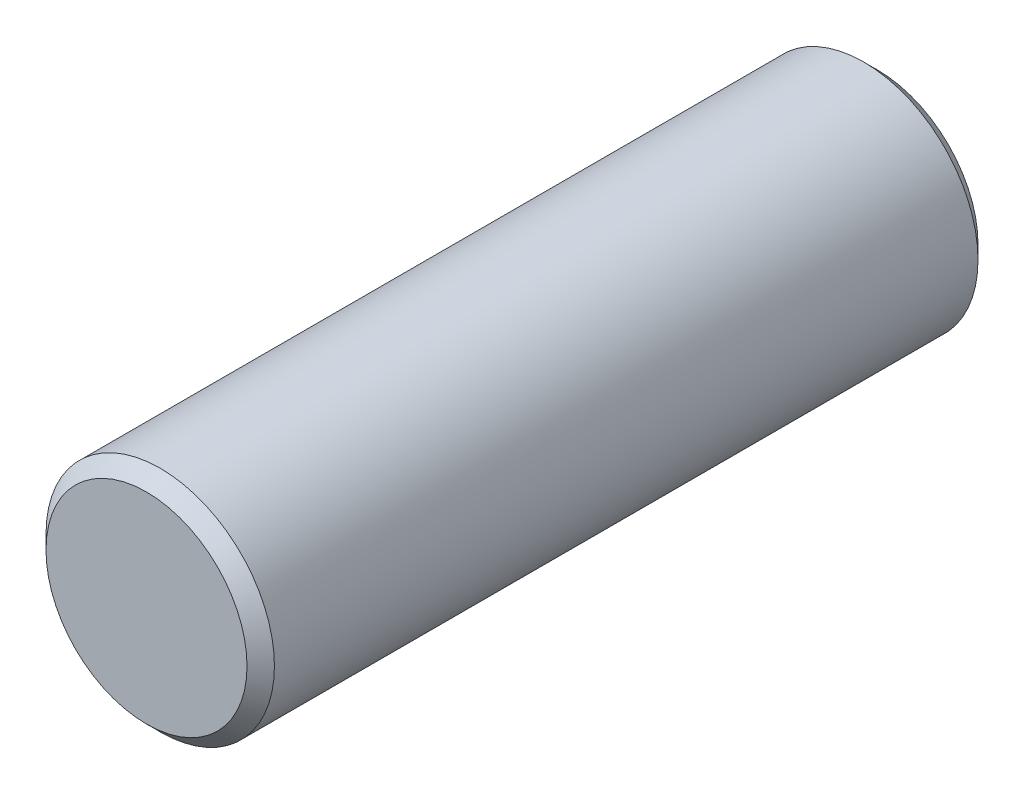
ISO-10303-21;
HEADER;
FILE_DESCRIPTION(('STEP AP214'),'2;1');
FILE_NAME('part.step','',(''),(''),'','','');
FILE_SCHEMA(('AUTOMOTIVE_DESIGN { 1 0 10303 214 1 1 1 1 }'));
ENDSEC;
DATA;
#1=APPLICATION_CONTEXT('core data for automotive mechanical design processes');
#2=APPLICATION_PROTOCOL_DEFINITION('international standard','automotive_design',2000,#1);
#3=PRODUCT_CONTEXT('',#1,'mechanical');
#4=PRODUCT('Part','Part','',(#3));
#5=PRODUCT_RELATED_PRODUCT_CATEGORY('part','',(#4));
#6=PRODUCT_DEFINITION_FORMATION('','',#4);
#7=PRODUCT_DEFINITION_CONTEXT('part definition',#1,'design');
#8=PRODUCT_DEFINITION('design','',#6,#7);
#9=PRODUCT_DEFINITION_SHAPE('','',#8);
#10=(LENGTH_UNIT() NAMED_UNIT(*) SI_UNIT(.MILLI.,.METRE.));
#11=(NAMED_UNIT(*) PLANE_ANGLE_UNIT() SI_UNIT($,.RADIAN.));
#12=(NAMED_UNIT(*) SI_UNIT($,.STERADIAN.) SOLID_ANGLE_UNIT());
#13=UNCERTAINTY_MEASURE_WITH_UNIT(LENGTH_MEASURE(1.E-05),#10,'distance_accuracy_value','');
#14=(GEOMETRIC_REPRESENTATION_CONTEXT(3) GLOBAL_UNCERTAINTY_ASSIGNED_CONTEXT((#13)) GLOBAL_UNIT_ASSIGNED_CONTEXT((#10,
#11,#12)) REPRESENTATION_CONTEXT('',''));
#15=CARTESIAN_POINT('',(0.,0.,0.));
#16=DIRECTION('',(0.,0.,1.));
#17=DIRECTION('',(1.,0.,0.));
#18=AXIS2_PLACEMENT_3D('',#15,#16,#17);
#19=CARTESIAN_POINT('',(0.,0.,-16.));
#20=DIRECTION('',(0.,0.,1.));
#21=DIRECTION('',(1.,0.,0.));
#22=AXIS2_PLACEMENT_3D('',#19,#20,#21);
#23=CYLINDRICAL_SURFACE('',#22,2.5);
#24=CARTESIAN_POINT('',(0.,0.,-15.7));
#25=DIRECTION('',(0.,0.,1.));
#26=DIRECTION('',(1.,0.,0.));
#27=AXIS2_PLACEMENT_3D('',#24,#25,#26);
#28=CIRCLE('',#27,2.5);
#29=CARTESIAN_POINT('',(2.5,0.,-15.7));
#30=VERTEX_POINT('',#29);
#31=EDGE_CURVE('E53',#30,#30,#28,.T.);
#32=ORIENTED_EDGE('',*,*,#31,.T.);
#33=EDGE_LOOP('',(#32));
#34=FACE_BOUND('',#33,.T.);
#35=CARTESIAN_POINT('',(0.,0.,-0.300000000000002));
#36=DIRECTION('',(0.,0.,1.));
#37=DIRECTION('',(1.,0.,0.));
#38=AXIS2_PLACEMENT_3D('',#35,#36,#37);
#39=CIRCLE('',#38,2.5);
#40=CARTESIAN_POINT('',(2.5,0.,-0.300000000000002));
#41=VERTEX_POINT('',#40);
#42=EDGE_CURVE('E58',#41,#41,#39,.F.);
#43=ORIENTED_EDGE('',*,*,#42,.T.);
#44=EDGE_LOOP('',(#43));
#45=FACE_BOUND('',#44,.T.);
#46=ADVANCED_FACE('F39',(#34,#45),#23,.T.);
#47=CARTESIAN_POINT('',(0.,0.,-16.));
#48=DIRECTION('',(0.,0.,1.));
#49=DIRECTION('',(1.,0.,0.));
#50=AXIS2_PLACEMENT_3D('',#47,#48,#49);
#51=PLANE('',#50);
#52=CARTESIAN_POINT('',(0.,0.,-16.));
#53=DIRECTION('',(0.,0.,1.));
#54=DIRECTION('',(1.,0.,0.));
#55=AXIS2_PLACEMENT_3D('',#52,#53,#54);
#56=CIRCLE('',#55,2.2);
#57=CARTESIAN_POINT('',(2.2,0.,-16.));
#58=VERTEX_POINT('',#57);
#59=EDGE_CURVE('E48',#58,#58,#56,.F.);
#60=ORIENTED_EDGE('',*,*,#59,.T.);
#61=EDGE_LOOP('',(#60));
#62=FACE_BOUND('',#61,.T.);
#63=ADVANCED_FACE('F75',(#62),#51,.F.);
#64=CARTESIAN_POINT('',(0.,0.,0.));
#65=DIRECTION('',(0.,0.,1.));
#66=DIRECTION('',(1.,0.,0.));
#67=AXIS2_PLACEMENT_3D('',#64,#65,#66);
#68=PLANE('',#67);
#69=CARTESIAN_POINT('',(0.,0.,0.));
#70=DIRECTION('',(0.,0.,1.));
#71=DIRECTION('',(1.,0.,0.));
#72=AXIS2_PLACEMENT_3D('',#69,#70,#71);
#73=CIRCLE('',#72,2.2);
#74=CARTESIAN_POINT('',(2.2,0.,0.));
#75=VERTEX_POINT('',#74);
#76=EDGE_CURVE('E10',#75,#75,#73,.T.);
#77=ORIENTED_EDGE('',*,*,#76,.T.);
#78=EDGE_LOOP('',(#77));
#79=FACE_BOUND('',#78,.T.);
#80=ADVANCED_FACE('F72',(#79),#68,.T.);
#81=CARTESIAN_POINT('',(0.,0.,-15.7));
#82=DIRECTION('',(0.,0.,1.));
#83=DIRECTION('',(1.,0.,0.));
#84=AXIS2_PLACEMENT_3D('',#81,#82,#83);
#85=CONICAL_SURFACE('',#84,2.5,0.78539816339745);
#86=ORIENTED_EDGE('',*,*,#59,.F.);
#87=EDGE_LOOP('',(#86));
#88=FACE_BOUND('',#87,.T.);
#89=ORIENTED_EDGE('',*,*,#31,.F.);
#90=EDGE_LOOP('',(#89));
#91=FACE_BOUND('',#90,.T.);
#92=ADVANCED_FACE('F68',(#88,#91),#85,.T.);
#93=CARTESIAN_POINT('',(0.,0.,0.));
#94=DIRECTION('',(0.,0.,-1.));
#95=DIRECTION('',(-1.,0.,0.));
#96=AXIS2_PLACEMENT_3D('',#93,#94,#95);
#97=CONICAL_SURFACE('',#96,2.2,0.785398163397448);
#98=ORIENTED_EDGE('',*,*,#42,.F.);
#99=EDGE_LOOP('',(#98));
#100=FACE_BOUND('',#99,.T.);
#101=ORIENTED_EDGE('',*,*,#76,.F.);
#102=EDGE_LOOP('',(#101));
#103=FACE_BOUND('',#102,.T.);
#104=ADVANCED_FACE('F42',(#100,#103),#97,.T.);
#105=CLOSED_SHELL('',(#46,#63,#80,#92,#104));
#106=MANIFOLD_SOLID_BREP('B2',#105);
#107=ADVANCED_BREP_SHAPE_REPRESENTATION('',(#18,#106),#14);
#108=SHAPE_DEFINITION_REPRESENTATION(#9,#107);
ENDSEC;
END-ISO-10303-21;
